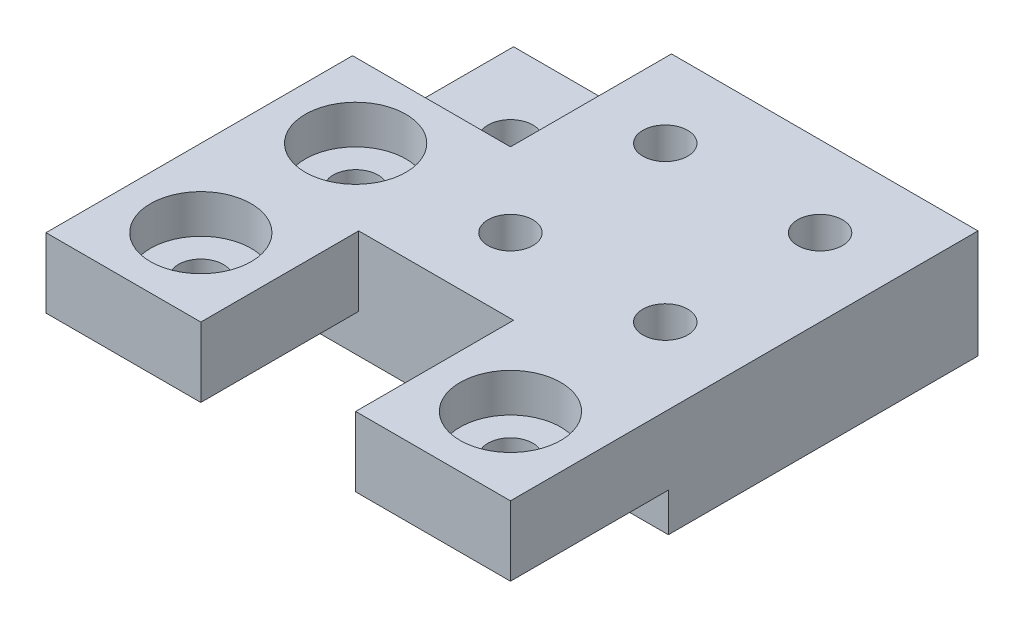
ISO-10303-21;
HEADER;
FILE_DESCRIPTION(('STEP AP214'),'2;1');
FILE_NAME('part.step','',(''),(''),'','','');
FILE_SCHEMA(('AUTOMOTIVE_DESIGN { 1 0 10303 214 1 1 1 1 }'));
ENDSEC;
DATA;
#1=APPLICATION_CONTEXT('core data for automotive mechanical design processes');
#2=APPLICATION_PROTOCOL_DEFINITION('international standard','automotive_design',2000,#1);
#3=PRODUCT_CONTEXT('',#1,'mechanical');
#4=PRODUCT('Part','Part','',(#3));
#5=PRODUCT_RELATED_PRODUCT_CATEGORY('part','',(#4));
#6=PRODUCT_DEFINITION_FORMATION('','',#4);
#7=PRODUCT_DEFINITION_CONTEXT('part definition',#1,'design');
#8=PRODUCT_DEFINITION('design','',#6,#7);
#9=PRODUCT_DEFINITION_SHAPE('','',#8);
#10=(LENGTH_UNIT() NAMED_UNIT(*) SI_UNIT(.MILLI.,.METRE.));
#11=(NAMED_UNIT(*) PLANE_ANGLE_UNIT() SI_UNIT($,.RADIAN.));
#12=(NAMED_UNIT(*) SI_UNIT($,.STERADIAN.) SOLID_ANGLE_UNIT());
#13=UNCERTAINTY_MEASURE_WITH_UNIT(LENGTH_MEASURE(1.E-05),#10,'distance_accuracy_value','');
#14=(GEOMETRIC_REPRESENTATION_CONTEXT(3) GLOBAL_UNCERTAINTY_ASSIGNED_CONTEXT((#13)) GLOBAL_UNIT_ASSIGNED_CONTEXT((#10,
#11,#12)) REPRESENTATION_CONTEXT('',''));
#15=CARTESIAN_POINT('',(0.,0.,0.));
#16=DIRECTION('',(0.,0.,1.));
#17=DIRECTION('',(1.,0.,0.));
#18=AXIS2_PLACEMENT_3D('',#15,#16,#17);
#19=CARTESIAN_POINT('',(-40.,2.5,50.));
#20=DIRECTION('',(1.,0.,0.));
#21=DIRECTION('',(0.,0.,-1.));
#22=AXIS2_PLACEMENT_3D('',#19,#20,#21);
#23=PLANE('',#22);
#24=DIRECTION('',(0.,0.,-1.));
#25=VECTOR('',#24,1.);
#26=CARTESIAN_POINT('',(-40.,2.5,50.));
#27=LINE('',#26,#25);
#28=CARTESIAN_POINT('',(-40.,2.5,60.));
#29=VERTEX_POINT('',#28);
#30=CARTESIAN_POINT('',(-40.,2.5,49.8000000000006));
#31=VERTEX_POINT('',#30);
#32=EDGE_CURVE('E255',#29,#31,#27,.T.);
#33=ORIENTED_EDGE('',*,*,#32,.T.);
#34=DIRECTION('',(0.,1.,0.));
#35=VECTOR('',#34,1.);
#36=CARTESIAN_POINT('',(-40.,0.,49.8000000000006));
#37=LINE('',#36,#35);
#38=CARTESIAN_POINT('',(-40.,7.,49.8000000000006));
#39=VERTEX_POINT('',#38);
#40=EDGE_CURVE('E175',#31,#39,#37,.T.);
#41=ORIENTED_EDGE('',*,*,#40,.T.);
#42=DIRECTION('',(0.,0.,-1.));
#43=VECTOR('',#42,1.);
#44=CARTESIAN_POINT('',(-40.,7.,50.));
#45=LINE('',#44,#43);
#46=CARTESIAN_POINT('',(-40.,7.,60.));
#47=VERTEX_POINT('',#46);
#48=EDGE_CURVE('E257',#47,#39,#45,.T.);
#49=ORIENTED_EDGE('',*,*,#48,.F.);
#50=DIRECTION('',(0.,1.,0.));
#51=VECTOR('',#50,1.);
#52=CARTESIAN_POINT('',(-40.,2.5,60.));
#53=LINE('',#52,#51);
#54=EDGE_CURVE('E245',#29,#47,#53,.T.);
#55=ORIENTED_EDGE('',*,*,#54,.F.);
#56=EDGE_LOOP('',(#33,#41,#49,#55));
#57=FACE_BOUND('',#56,.T.);
#58=ADVANCED_FACE('F39',(#57),#23,.T.);
#59=CARTESIAN_POINT('',(-30.,2.5,50.));
#60=DIRECTION('',(-1.,0.,0.));
#61=DIRECTION('',(0.,0.,1.));
#62=AXIS2_PLACEMENT_3D('',#59,#60,#61);
#63=PLANE('',#62);
#64=DIRECTION('',(0.,1.,0.));
#65=VECTOR('',#64,1.);
#66=CARTESIAN_POINT('',(-30.,0.,49.8000000000006));
#67=LINE('',#66,#65);
#68=CARTESIAN_POINT('',(-30.,2.5,49.8000000000006));
#69=VERTEX_POINT('',#68);
#70=CARTESIAN_POINT('',(-30.,7.,49.8000000000006));
#71=VERTEX_POINT('',#70);
#72=EDGE_CURVE('E176',#69,#71,#67,.T.);
#73=ORIENTED_EDGE('',*,*,#72,.F.);
#74=DIRECTION('',(0.,0.,1.));
#75=VECTOR('',#74,1.);
#76=CARTESIAN_POINT('',(-30.,2.5,50.));
#77=LINE('',#76,#75);
#78=CARTESIAN_POINT('',(-30.,2.5,60.));
#79=VERTEX_POINT('',#78);
#80=EDGE_CURVE('E145',#69,#79,#77,.T.);
#81=ORIENTED_EDGE('',*,*,#80,.T.);
#82=DIRECTION('',(0.,1.,0.));
#83=VECTOR('',#82,1.);
#84=CARTESIAN_POINT('',(-30.,2.5,60.));
#85=LINE('',#84,#83);
#86=CARTESIAN_POINT('',(-30.,7.,60.));
#87=VERTEX_POINT('',#86);
#88=EDGE_CURVE('E236',#79,#87,#85,.T.);
#89=ORIENTED_EDGE('',*,*,#88,.T.);
#90=DIRECTION('',(0.,0.,1.));
#91=VECTOR('',#90,1.);
#92=CARTESIAN_POINT('',(-30.,7.,50.));
#93=LINE('',#92,#91);
#94=EDGE_CURVE('E243',#71,#87,#93,.T.);
#95=ORIENTED_EDGE('',*,*,#94,.F.);
#96=EDGE_LOOP('',(#73,#81,#89,#95));
#97=FACE_BOUND('',#96,.T.);
#98=ADVANCED_FACE('F320',(#97),#63,.T.);
#99=CARTESIAN_POINT('',(-20.,2.5,50.));
#100=DIRECTION('',(1.,0.,0.));
#101=DIRECTION('',(0.,0.,-1.));
#102=AXIS2_PLACEMENT_3D('',#99,#100,#101);
#103=PLANE('',#102);
#104=DIRECTION('',(0.,0.,-1.));
#105=VECTOR('',#104,1.);
#106=CARTESIAN_POINT('',(-20.,2.5,50.));
#107=LINE('',#106,#105);
#108=CARTESIAN_POINT('',(-20.,2.5,60.));
#109=VERTEX_POINT('',#108);
#110=CARTESIAN_POINT('',(-20.,2.5,49.8000000000006));
#111=VERTEX_POINT('',#110);
#112=EDGE_CURVE('E238',#109,#111,#107,.T.);
#113=ORIENTED_EDGE('',*,*,#112,.T.);
#114=DIRECTION('',(0.,1.,0.));
#115=VECTOR('',#114,1.);
#116=CARTESIAN_POINT('',(-20.,0.,49.8000000000006));
#117=LINE('',#116,#115);
#118=CARTESIAN_POINT('',(-20.,0.,49.8000000000006));
#119=VERTEX_POINT('',#118);
#120=EDGE_CURVE('E11',#119,#111,#117,.T.);
#121=ORIENTED_EDGE('',*,*,#120,.F.);
#122=DIRECTION('',(0.,0.,-1.));
#123=VECTOR('',#122,1.);
#124=CARTESIAN_POINT('',(-20.,0.,0.));
#125=LINE('',#124,#123);
#126=CARTESIAN_POINT('',(-20.,0.,29.8));
#127=VERTEX_POINT('',#126);
#128=EDGE_CURVE('E152',#119,#127,#125,.T.);
#129=ORIENTED_EDGE('',*,*,#128,.T.);
#130=DIRECTION('',(0.,1.,0.));
#131=VECTOR('',#130,1.);
#132=CARTESIAN_POINT('',(-20.,-8.,29.8));
#133=LINE('',#132,#131);
#134=CARTESIAN_POINT('',(-20.,7.,29.8));
#135=VERTEX_POINT('',#134);
#136=EDGE_CURVE('E148',#127,#135,#133,.T.);
#137=ORIENTED_EDGE('',*,*,#136,.T.);
#138=DIRECTION('',(0.,0.,-1.));
#139=VECTOR('',#138,1.);
#140=CARTESIAN_POINT('',(-20.,7.,50.));
#141=LINE('',#140,#139);
#142=CARTESIAN_POINT('',(-20.,7.,60.));
#143=VERTEX_POINT('',#142);
#144=EDGE_CURVE('E134',#143,#135,#141,.T.);
#145=ORIENTED_EDGE('',*,*,#144,.F.);
#146=DIRECTION('',(0.,1.,0.));
#147=VECTOR('',#146,1.);
#148=CARTESIAN_POINT('',(-20.,2.5,60.));
#149=LINE('',#148,#147);
#150=EDGE_CURVE('E239',#109,#143,#149,.T.);
#151=ORIENTED_EDGE('',*,*,#150,.F.);
#152=EDGE_LOOP('',(#113,#121,#129,#137,#145,#151));
#153=FACE_BOUND('',#152,.T.);
#154=ADVANCED_FACE('F150',(#153),#103,.T.);
#155=CARTESIAN_POINT('',(-24.9999999999989,0.,55.));
#156=DIRECTION('',(0.,1.,0.));
#157=DIRECTION('',(0.,0.,1.));
#158=AXIS2_PLACEMENT_3D('',#155,#156,#157);
#159=CYLINDRICAL_SURFACE('',#158,1.45);
#160=CARTESIAN_POINT('',(-24.9999999999989,2.5,55.));
#161=DIRECTION('',(0.,1.,0.));
#162=DIRECTION('',(0.,0.,1.));
#163=AXIS2_PLACEMENT_3D('',#160,#161,#162);
#164=CIRCLE('',#163,1.45);
#165=CARTESIAN_POINT('',(-24.9999999999989,2.5,56.45));
#166=VERTEX_POINT('',#165);
#167=EDGE_CURVE('E227',#166,#166,#164,.T.);
#168=ORIENTED_EDGE('',*,*,#167,.F.);
#169=EDGE_LOOP('',(#168));
#170=FACE_BOUND('',#169,.T.);
#171=CARTESIAN_POINT('',(-24.9999999999989,4.5,55.));
#172=DIRECTION('',(0.,1.,0.));
#173=DIRECTION('',(0.,0.,1.));
#174=AXIS2_PLACEMENT_3D('',#171,#172,#173);
#175=CIRCLE('',#174,1.45);
#176=CARTESIAN_POINT('',(-24.9999999999989,4.5,56.45));
#177=VERTEX_POINT('',#176);
#178=EDGE_CURVE('E211',#177,#177,#175,.F.);
#179=ORIENTED_EDGE('',*,*,#178,.F.);
#180=EDGE_LOOP('',(#179));
#181=FACE_BOUND('',#180,.T.);
#182=ADVANCED_FACE('F307',(#170,#181),#159,.F.);
#183=CARTESIAN_POINT('',(-44.9999999999989,0.,55.));
#184=DIRECTION('',(0.,1.,0.));
#185=DIRECTION('',(0.,0.,1.));
#186=AXIS2_PLACEMENT_3D('',#183,#184,#185);
#187=CYLINDRICAL_SURFACE('',#186,1.45);
#188=CARTESIAN_POINT('',(-44.9999999999989,2.5,55.));
#189=DIRECTION('',(0.,1.,0.));
#190=DIRECTION('',(0.,0.,1.));
#191=AXIS2_PLACEMENT_3D('',#188,#189,#190);
#192=CIRCLE('',#191,1.45);
#193=CARTESIAN_POINT('',(-44.9999999999989,2.5,56.45));
#194=VERTEX_POINT('',#193);
#195=EDGE_CURVE('E293',#194,#194,#192,.T.);
#196=ORIENTED_EDGE('',*,*,#195,.F.);
#197=EDGE_LOOP('',(#196));
#198=FACE_BOUND('',#197,.T.);
#199=CARTESIAN_POINT('',(-44.9999999999989,4.5,55.));
#200=DIRECTION('',(0.,1.,0.));
#201=DIRECTION('',(0.,0.,1.));
#202=AXIS2_PLACEMENT_3D('',#199,#200,#201);
#203=CIRCLE('',#202,1.45);
#204=CARTESIAN_POINT('',(-44.9999999999989,4.5,56.45));
#205=VERTEX_POINT('',#204);
#206=EDGE_CURVE('E300',#205,#205,#203,.F.);
#207=ORIENTED_EDGE('',*,*,#206,.F.);
#208=EDGE_LOOP('',(#207));
#209=FACE_BOUND('',#208,.T.);
#210=ADVANCED_FACE('F309',(#198,#209),#187,.F.);
#211=CARTESIAN_POINT('',(-44.999999999999,0.,45.));
#212=DIRECTION('',(0.,1.,0.));
#213=DIRECTION('',(0.,0.,1.));
#214=AXIS2_PLACEMENT_3D('',#211,#212,#213);
#215=CYLINDRICAL_SURFACE('',#214,1.45);
#216=CARTESIAN_POINT('',(-44.999999999999,0.,45.));
#217=DIRECTION('',(0.,1.,0.));
#218=DIRECTION('',(0.,0.,1.));
#219=AXIS2_PLACEMENT_3D('',#216,#217,#218);
#220=CIRCLE('',#219,1.45);
#221=CARTESIAN_POINT('',(-44.999999999999,0.,46.45));
#222=VERTEX_POINT('',#221);
#223=EDGE_CURVE('E208',#222,#222,#220,.T.);
#224=ORIENTED_EDGE('',*,*,#223,.F.);
#225=EDGE_LOOP('',(#224));
#226=FACE_BOUND('',#225,.T.);
#227=CARTESIAN_POINT('',(-44.999999999999,4.5,45.));
#228=DIRECTION('',(0.,1.,0.));
#229=DIRECTION('',(0.,0.,1.));
#230=AXIS2_PLACEMENT_3D('',#227,#228,#229);
#231=CIRCLE('',#230,1.45);
#232=CARTESIAN_POINT('',(-44.999999999999,4.5,46.45));
#233=VERTEX_POINT('',#232);
#234=EDGE_CURVE('E201',#233,#233,#231,.F.);
#235=ORIENTED_EDGE('',*,*,#234,.F.);
#236=EDGE_LOOP('',(#235));
#237=FACE_BOUND('',#236,.T.);
#238=ADVANCED_FACE('F316',(#226,#237),#215,.F.);
#239=CARTESIAN_POINT('',(-50.,7.,50.));
#240=DIRECTION('',(1.,0.,0.));
#241=DIRECTION('',(0.,0.,-1.));
#242=AXIS2_PLACEMENT_3D('',#239,#240,#241);
#243=PLANE('',#242);
#244=DIRECTION('',(0.,0.,1.));
#245=VECTOR('',#244,1.);
#246=CARTESIAN_POINT('',(-50.,2.3,50.));
#247=LINE('',#246,#245);
#248=CARTESIAN_POINT('',(-50.,2.3,29.8));
#249=VERTEX_POINT('',#248);
#250=CARTESIAN_POINT('',(-50.,2.3,40.2));
#251=VERTEX_POINT('',#250);
#252=EDGE_CURVE('E47',#249,#251,#247,.T.);
#253=ORIENTED_EDGE('',*,*,#252,.F.);
#254=DIRECTION('',(0.,1.,0.));
#255=VECTOR('',#254,1.);
#256=CARTESIAN_POINT('',(-50.,-8.,29.8));
#257=LINE('',#256,#255);
#258=CARTESIAN_POINT('',(-50.,0.,29.8));
#259=VERTEX_POINT('',#258);
#260=EDGE_CURVE('E155',#259,#249,#257,.T.);
#261=ORIENTED_EDGE('',*,*,#260,.F.);
#262=DIRECTION('',(0.,0.,1.));
#263=VECTOR('',#262,1.);
#264=CARTESIAN_POINT('',(-50.,0.,50.));
#265=LINE('',#264,#263);
#266=CARTESIAN_POINT('',(-50.,0.,49.8000000000006));
#267=VERTEX_POINT('',#266);
#268=EDGE_CURVE('E284',#259,#267,#265,.T.);
#269=ORIENTED_EDGE('',*,*,#268,.T.);
#270=DIRECTION('',(0.,1.,0.));
#271=VECTOR('',#270,1.);
#272=CARTESIAN_POINT('',(-50.,7.,49.8000000000006));
#273=LINE('',#272,#271);
#274=CARTESIAN_POINT('',(-50.,2.5,49.8000000000006));
#275=VERTEX_POINT('',#274);
#276=EDGE_CURVE('E170',#267,#275,#273,.T.);
#277=ORIENTED_EDGE('',*,*,#276,.T.);
#278=DIRECTION('',(0.,0.,1.));
#279=VECTOR('',#278,1.);
#280=CARTESIAN_POINT('',(-50.,2.5,50.));
#281=LINE('',#280,#279);
#282=CARTESIAN_POINT('',(-50.,2.5,60.));
#283=VERTEX_POINT('',#282);
#284=EDGE_CURVE('E261',#275,#283,#281,.T.);
#285=ORIENTED_EDGE('',*,*,#284,.T.);
#286=DIRECTION('',(0.,1.,0.));
#287=VECTOR('',#286,1.);
#288=CARTESIAN_POINT('',(-50.,2.5,60.));
#289=LINE('',#288,#287);
#290=CARTESIAN_POINT('',(-50.,7.,60.));
#291=VERTEX_POINT('',#290);
#292=EDGE_CURVE('E252',#283,#291,#289,.T.);
#293=ORIENTED_EDGE('',*,*,#292,.T.);
#294=DIRECTION('',(0.,0.,1.));
#295=VECTOR('',#294,1.);
#296=CARTESIAN_POINT('',(-50.,7.,50.));
#297=LINE('',#296,#295);
#298=CARTESIAN_POINT('',(-50.,7.,40.2));
#299=VERTEX_POINT('',#298);
#300=EDGE_CURVE('E285',#299,#291,#297,.T.);
#301=ORIENTED_EDGE('',*,*,#300,.F.);
#302=DIRECTION('',(0.,-1.,0.));
#303=VECTOR('',#302,1.);
#304=CARTESIAN_POINT('',(-50.,7.,40.2));
#305=LINE('',#304,#303);
#306=EDGE_CURVE('E54',#299,#251,#305,.T.);
#307=ORIENTED_EDGE('',*,*,#306,.T.);
#308=EDGE_LOOP('',(#253,#261,#269,#277,#285,#293,#301,#307));
#309=FACE_BOUND('',#308,.T.);
#310=ADVANCED_FACE('F41',(#309),#243,.F.);
#311=CARTESIAN_POINT('',(0.,7.,0.));
#312=DIRECTION('',(0.,-1.,0.));
#313=DIRECTION('',(0.,0.,-1.));
#314=AXIS2_PLACEMENT_3D('',#311,#312,#313);
#315=PLANE('',#314);
#316=CARTESIAN_POINT('',(-24.9999999999989,7.,55.));
#317=DIRECTION('',(0.,1.,0.));
#318=DIRECTION('',(0.,0.,1.));
#319=AXIS2_PLACEMENT_3D('',#316,#317,#318);
#320=CIRCLE('',#319,3.25);
#321=CARTESIAN_POINT('',(-24.9999999999989,7.,58.25));
#322=VERTEX_POINT('',#321);
#323=EDGE_CURVE('E198',#322,#322,#320,.T.);
#324=ORIENTED_EDGE('',*,*,#323,.F.);
#325=EDGE_LOOP('',(#324));
#326=FACE_BOUND('',#325,.T.);
#327=CARTESIAN_POINT('',(-44.999999999999,7.,45.));
#328=DIRECTION('',(0.,1.,0.));
#329=DIRECTION('',(0.,0.,1.));
#330=AXIS2_PLACEMENT_3D('',#327,#328,#329);
#331=CIRCLE('',#330,3.25);
#332=CARTESIAN_POINT('',(-44.999999999999,7.,48.25));
#333=VERTEX_POINT('',#332);
#334=EDGE_CURVE('E186',#333,#333,#331,.T.);
#335=ORIENTED_EDGE('',*,*,#334,.F.);
#336=EDGE_LOOP('',(#335));
#337=FACE_BOUND('',#336,.T.);
#338=CARTESIAN_POINT('',(-44.9999999999989,7.,55.));
#339=DIRECTION('',(0.,1.,0.));
#340=DIRECTION('',(0.,0.,1.));
#341=AXIS2_PLACEMENT_3D('',#338,#339,#340);
#342=CIRCLE('',#341,3.25);
#343=CARTESIAN_POINT('',(-44.9999999999989,7.,58.25));
#344=VERTEX_POINT('',#343);
#345=EDGE_CURVE('E193',#344,#344,#342,.T.);
#346=ORIENTED_EDGE('',*,*,#345,.F.);
#347=EDGE_LOOP('',(#346));
#348=FACE_BOUND('',#347,.T.);
#349=CARTESIAN_POINT('',(-24.9999999999992,7.,35.));
#350=DIRECTION('',(0.,1.,0.));
#351=DIRECTION('',(0.,0.,1.));
#352=AXIS2_PLACEMENT_3D('',#349,#350,#351);
#353=CIRCLE('',#352,1.45);
#354=CARTESIAN_POINT('',(-24.9999999999992,7.,36.45));
#355=VERTEX_POINT('',#354);
#356=EDGE_CURVE('E224',#355,#355,#353,.T.);
#357=ORIENTED_EDGE('',*,*,#356,.F.);
#358=EDGE_LOOP('',(#357));
#359=FACE_BOUND('',#358,.T.);
#360=CARTESIAN_POINT('',(-34.9999999999991,7.,35.));
#361=DIRECTION('',(0.,1.,0.));
#362=DIRECTION('',(0.,0.,1.));
#363=AXIS2_PLACEMENT_3D('',#360,#361,#362);
#364=CIRCLE('',#363,1.45);
#365=CARTESIAN_POINT('',(-34.9999999999991,7.,36.45));
#366=VERTEX_POINT('',#365);
#367=EDGE_CURVE('E231',#366,#366,#364,.T.);
#368=ORIENTED_EDGE('',*,*,#367,.F.);
#369=EDGE_LOOP('',(#368));
#370=FACE_BOUND('',#369,.T.);
#371=CARTESIAN_POINT('',(-34.999999999999,7.,45.));
#372=DIRECTION('',(0.,1.,0.));
#373=DIRECTION('',(0.,0.,1.));
#374=AXIS2_PLACEMENT_3D('',#371,#372,#373);
#375=CIRCLE('',#374,1.45);
#376=CARTESIAN_POINT('',(-34.999999999999,7.,46.45));
#377=VERTEX_POINT('',#376);
#378=EDGE_CURVE('E219',#377,#377,#375,.T.);
#379=ORIENTED_EDGE('',*,*,#378,.F.);
#380=EDGE_LOOP('',(#379));
#381=FACE_BOUND('',#380,.T.);
#382=CARTESIAN_POINT('',(-24.999999999999,7.,45.));
#383=DIRECTION('',(0.,1.,0.));
#384=DIRECTION('',(0.,0.,1.));
#385=AXIS2_PLACEMENT_3D('',#382,#383,#384);
#386=CIRCLE('',#385,1.45);
#387=CARTESIAN_POINT('',(-24.999999999999,7.,46.45));
#388=VERTEX_POINT('',#387);
#389=EDGE_CURVE('E212',#388,#388,#386,.T.);
#390=ORIENTED_EDGE('',*,*,#389,.F.);
#391=EDGE_LOOP('',(#390));
#392=FACE_BOUND('',#391,.T.);
#393=ORIENTED_EDGE('',*,*,#144,.T.);
#394=DIRECTION('',(1.,0.,0.));
#395=VECTOR('',#394,1.);
#396=CARTESIAN_POINT('',(-50.,7.,29.8));
#397=LINE('',#396,#395);
#398=CARTESIAN_POINT('',(-39.7999999999992,7.,29.8));
#399=VERTEX_POINT('',#398);
#400=EDGE_CURVE('E139',#399,#135,#397,.T.);
#401=ORIENTED_EDGE('',*,*,#400,.F.);
#402=DIRECTION('',(0.,0.,-1.));
#403=VECTOR('',#402,1.);
#404=CARTESIAN_POINT('',(-39.7999999999992,7.,29.8));
#405=LINE('',#404,#403);
#406=CARTESIAN_POINT('',(-39.7999999999992,7.,40.2));
#407=VERTEX_POINT('',#406);
#408=EDGE_CURVE('E275',#407,#399,#405,.T.);
#409=ORIENTED_EDGE('',*,*,#408,.F.);
#410=DIRECTION('',(-1.,0.,0.));
#411=VECTOR('',#410,1.);
#412=CARTESIAN_POINT('',(0.,7.,40.2));
#413=LINE('',#412,#411);
#414=EDGE_CURVE('E287',#407,#299,#413,.T.);
#415=ORIENTED_EDGE('',*,*,#414,.T.);
#416=ORIENTED_EDGE('',*,*,#300,.T.);
#417=DIRECTION('',(1.,0.,0.));
#418=VECTOR('',#417,1.);
#419=CARTESIAN_POINT('',(-50.,7.,60.));
#420=LINE('',#419,#418);
#421=EDGE_CURVE('E260',#291,#47,#420,.T.);
#422=ORIENTED_EDGE('',*,*,#421,.T.);
#423=ORIENTED_EDGE('',*,*,#48,.T.);
#424=DIRECTION('',(-1.,0.,0.));
#425=VECTOR('',#424,1.);
#426=CARTESIAN_POINT('',(-30.,7.,49.8000000000006));
#427=LINE('',#426,#425);
#428=EDGE_CURVE('E180',#71,#39,#427,.T.);
#429=ORIENTED_EDGE('',*,*,#428,.F.);
#430=ORIENTED_EDGE('',*,*,#94,.T.);
#431=DIRECTION('',(1.,0.,0.));
#432=VECTOR('',#431,1.);
#433=CARTESIAN_POINT('',(-30.,7.,60.));
#434=LINE('',#433,#432);
#435=EDGE_CURVE('E143',#87,#143,#434,.T.);
#436=ORIENTED_EDGE('',*,*,#435,.T.);
#437=EDGE_LOOP('',(#393,#401,#409,#415,#416,#422,#423,#429,#430,#436));
#438=FACE_BOUND('',#437,.T.);
#439=ADVANCED_FACE('F136',(#326,#337,#348,#359,#370,#381,#392,#438),#315,.F.);
#440=CARTESIAN_POINT('',(0.,0.,0.));
#441=DIRECTION('',(0.,-1.,0.));
#442=DIRECTION('',(0.,0.,-1.));
#443=AXIS2_PLACEMENT_3D('',#440,#441,#442);
#444=PLANE('',#443);
#445=ORIENTED_EDGE('',*,*,#128,.F.);
#446=DIRECTION('',(-1.,0.,0.));
#447=VECTOR('',#446,1.);
#448=CARTESIAN_POINT('',(-30.,0.,49.8000000000006));
#449=LINE('',#448,#447);
#450=EDGE_CURVE('E178',#119,#267,#449,.T.);
#451=ORIENTED_EDGE('',*,*,#450,.T.);
#452=ORIENTED_EDGE('',*,*,#268,.F.);
#453=DIRECTION('',(-1.,0.,0.));
#454=VECTOR('',#453,1.);
#455=CARTESIAN_POINT('',(0.,0.,29.8));
#456=LINE('',#455,#454);
#457=EDGE_CURVE('E164',#127,#259,#456,.T.);
#458=ORIENTED_EDGE('',*,*,#457,.F.);
#459=EDGE_LOOP('',(#445,#451,#452,#458));
#460=FACE_BOUND('',#459,.T.);
#461=CARTESIAN_POINT('',(-44.9999999999992,0.,35.));
#462=DIRECTION('',(0.,1.,0.));
#463=DIRECTION('',(0.,0.,1.));
#464=AXIS2_PLACEMENT_3D('',#461,#462,#463);
#465=CIRCLE('',#464,1.45);
#466=CARTESIAN_POINT('',(-44.9999999999992,0.,36.45));
#467=VERTEX_POINT('',#466);
#468=EDGE_CURVE('E204',#467,#467,#465,.T.);
#469=ORIENTED_EDGE('',*,*,#468,.T.);
#470=EDGE_LOOP('',(#469));
#471=FACE_BOUND('',#470,.T.);
#472=ORIENTED_EDGE('',*,*,#223,.T.);
#473=EDGE_LOOP('',(#472));
#474=FACE_BOUND('',#473,.T.);
#475=CARTESIAN_POINT('',(-24.9999999999992,0.,35.));
#476=DIRECTION('',(0.,1.,0.));
#477=DIRECTION('',(0.,0.,1.));
#478=AXIS2_PLACEMENT_3D('',#475,#476,#477);
#479=CIRCLE('',#478,1.45);
#480=CARTESIAN_POINT('',(-24.9999999999992,0.,36.45));
#481=VERTEX_POINT('',#480);
#482=EDGE_CURVE('E228',#481,#481,#479,.T.);
#483=ORIENTED_EDGE('',*,*,#482,.T.);
#484=EDGE_LOOP('',(#483));
#485=FACE_BOUND('',#484,.T.);
#486=CARTESIAN_POINT('',(-34.9999999999991,0.,35.));
#487=DIRECTION('',(0.,1.,0.));
#488=DIRECTION('',(0.,0.,1.));
#489=AXIS2_PLACEMENT_3D('',#486,#487,#488);
#490=CIRCLE('',#489,1.45);
#491=CARTESIAN_POINT('',(-34.9999999999991,0.,36.45));
#492=VERTEX_POINT('',#491);
#493=EDGE_CURVE('E215',#492,#492,#490,.T.);
#494=ORIENTED_EDGE('',*,*,#493,.T.);
#495=EDGE_LOOP('',(#494));
#496=FACE_BOUND('',#495,.T.);
#497=CARTESIAN_POINT('',(-34.999999999999,0.,45.));
#498=DIRECTION('',(0.,1.,0.));
#499=DIRECTION('',(0.,0.,1.));
#500=AXIS2_PLACEMENT_3D('',#497,#498,#499);
#501=CIRCLE('',#500,1.45);
#502=CARTESIAN_POINT('',(-34.999999999999,0.,46.45));
#503=VERTEX_POINT('',#502);
#504=EDGE_CURVE('E207',#503,#503,#501,.T.);
#505=ORIENTED_EDGE('',*,*,#504,.T.);
#506=EDGE_LOOP('',(#505));
#507=FACE_BOUND('',#506,.T.);
#508=CARTESIAN_POINT('',(-24.999999999999,0.,45.));
#509=DIRECTION('',(0.,1.,0.));
#510=DIRECTION('',(0.,0.,1.));
#511=AXIS2_PLACEMENT_3D('',#508,#509,#510);
#512=CIRCLE('',#511,1.45);
#513=CARTESIAN_POINT('',(-24.999999999999,0.,46.45));
#514=VERTEX_POINT('',#513);
#515=EDGE_CURVE('E216',#514,#514,#512,.T.);
#516=ORIENTED_EDGE('',*,*,#515,.T.);
#517=EDGE_LOOP('',(#516));
#518=FACE_BOUND('',#517,.T.);
#519=ADVANCED_FACE('F353',(#460,#471,#474,#485,#496,#507,#518),#444,.T.);
#520=CARTESIAN_POINT('',(0.,2.3,0.));
#521=DIRECTION('',(0.,1.,0.));
#522=DIRECTION('',(0.,0.,1.));
#523=AXIS2_PLACEMENT_3D('',#520,#521,#522);
#524=PLANE('',#523);
#525=CARTESIAN_POINT('',(-44.9999999999992,2.3,35.));
#526=DIRECTION('',(0.,1.,0.));
#527=DIRECTION('',(0.,0.,1.));
#528=AXIS2_PLACEMENT_3D('',#525,#526,#527);
#529=CIRCLE('',#528,1.45);
#530=CARTESIAN_POINT('',(-44.9999999999992,2.3,36.45));
#531=VERTEX_POINT('',#530);
#532=EDGE_CURVE('E240',#531,#531,#529,.T.);
#533=ORIENTED_EDGE('',*,*,#532,.F.);
#534=EDGE_LOOP('',(#533));
#535=FACE_BOUND('',#534,.T.);
#536=ORIENTED_EDGE('',*,*,#252,.T.);
#537=DIRECTION('',(1.,0.,0.));
#538=VECTOR('',#537,1.);
#539=CARTESIAN_POINT('',(-50.1999999999992,2.3,40.2));
#540=LINE('',#539,#538);
#541=CARTESIAN_POINT('',(-39.7999999999992,2.3,40.2));
#542=VERTEX_POINT('',#541);
#543=EDGE_CURVE('E277',#251,#542,#540,.T.);
#544=ORIENTED_EDGE('',*,*,#543,.T.);
#545=DIRECTION('',(0.,0.,-1.));
#546=VECTOR('',#545,1.);
#547=CARTESIAN_POINT('',(-39.7999999999992,2.3,29.8));
#548=LINE('',#547,#546);
#549=CARTESIAN_POINT('',(-39.7999999999992,2.3,29.8));
#550=VERTEX_POINT('',#549);
#551=EDGE_CURVE('E279',#542,#550,#548,.T.);
#552=ORIENTED_EDGE('',*,*,#551,.T.);
#553=DIRECTION('',(-1.,0.,0.));
#554=VECTOR('',#553,1.);
#555=CARTESIAN_POINT('',(-50.1999999999992,2.3,29.8));
#556=LINE('',#555,#554);
#557=EDGE_CURVE('E273',#550,#249,#556,.T.);
#558=ORIENTED_EDGE('',*,*,#557,.T.);
#559=EDGE_LOOP('',(#536,#544,#552,#558));
#560=FACE_BOUND('',#559,.T.);
#561=ADVANCED_FACE('F347',(#535,#560),#524,.T.);
#562=CARTESIAN_POINT('',(-50.1999999999992,2.3,40.2));
#563=DIRECTION('',(0.,0.,1.));
#564=DIRECTION('',(1.,0.,0.));
#565=AXIS2_PLACEMENT_3D('',#562,#563,#564);
#566=PLANE('',#565);
#567=ORIENTED_EDGE('',*,*,#414,.F.);
#568=DIRECTION('',(0.,1.,0.));
#569=VECTOR('',#568,1.);
#570=CARTESIAN_POINT('',(-39.7999999999992,2.3,40.2));
#571=LINE('',#570,#569);
#572=EDGE_CURVE('E270',#542,#407,#571,.T.);
#573=ORIENTED_EDGE('',*,*,#572,.F.);
#574=ORIENTED_EDGE('',*,*,#543,.F.);
#575=ORIENTED_EDGE('',*,*,#306,.F.);
#576=EDGE_LOOP('',(#567,#573,#574,#575));
#577=FACE_BOUND('',#576,.T.);
#578=ADVANCED_FACE('F343',(#577),#566,.F.);
#579=CARTESIAN_POINT('',(-39.7999999999992,2.3,29.8));
#580=DIRECTION('',(1.,0.,0.));
#581=DIRECTION('',(0.,0.,-1.));
#582=AXIS2_PLACEMENT_3D('',#579,#580,#581);
#583=PLANE('',#582);
#584=ORIENTED_EDGE('',*,*,#408,.T.);
#585=DIRECTION('',(0.,1.,0.));
#586=VECTOR('',#585,1.);
#587=CARTESIAN_POINT('',(-39.7999999999992,2.3,29.8));
#588=LINE('',#587,#586);
#589=EDGE_CURVE('E159',#550,#399,#588,.T.);
#590=ORIENTED_EDGE('',*,*,#589,.F.);
#591=ORIENTED_EDGE('',*,*,#551,.F.);
#592=ORIENTED_EDGE('',*,*,#572,.T.);
#593=EDGE_LOOP('',(#584,#590,#591,#592));
#594=FACE_BOUND('',#593,.T.);
#595=ADVANCED_FACE('F346',(#594),#583,.F.);
#596=CARTESIAN_POINT('',(-50.,2.5,60.));
#597=DIRECTION('',(0.,0.,1.));
#598=DIRECTION('',(1.,0.,0.));
#599=AXIS2_PLACEMENT_3D('',#596,#597,#598);
#600=PLANE('',#599);
#601=ORIENTED_EDGE('',*,*,#421,.F.);
#602=ORIENTED_EDGE('',*,*,#292,.F.);
#603=DIRECTION('',(1.,0.,0.));
#604=VECTOR('',#603,1.);
#605=CARTESIAN_POINT('',(-50.,2.5,60.));
#606=LINE('',#605,#604);
#607=EDGE_CURVE('E265',#283,#29,#606,.T.);
#608=ORIENTED_EDGE('',*,*,#607,.T.);
#609=ORIENTED_EDGE('',*,*,#54,.T.);
#610=EDGE_LOOP('',(#601,#602,#608,#609));
#611=FACE_BOUND('',#610,.T.);
#612=ADVANCED_FACE('F336',(#611),#600,.T.);
#613=CARTESIAN_POINT('',(0.,2.5,0.));
#614=DIRECTION('',(0.,1.,0.));
#615=DIRECTION('',(0.,0.,1.));
#616=AXIS2_PLACEMENT_3D('',#613,#614,#615);
#617=PLANE('',#616);
#618=ORIENTED_EDGE('',*,*,#195,.T.);
#619=EDGE_LOOP('',(#618));
#620=FACE_BOUND('',#619,.T.);
#621=ORIENTED_EDGE('',*,*,#284,.F.);
#622=DIRECTION('',(1.,0.,0.));
#623=VECTOR('',#622,1.);
#624=CARTESIAN_POINT('',(-40.,2.5,49.8000000000006));
#625=LINE('',#624,#623);
#626=EDGE_CURVE('E167',#275,#31,#625,.T.);
#627=ORIENTED_EDGE('',*,*,#626,.T.);
#628=ORIENTED_EDGE('',*,*,#32,.F.);
#629=ORIENTED_EDGE('',*,*,#607,.F.);
#630=EDGE_LOOP('',(#621,#627,#628,#629));
#631=FACE_BOUND('',#630,.T.);
#632=ADVANCED_FACE('F338',(#620,#631),#617,.F.);
#633=CARTESIAN_POINT('',(-30.,2.5,60.));
#634=DIRECTION('',(0.,0.,1.));
#635=DIRECTION('',(1.,0.,0.));
#636=AXIS2_PLACEMENT_3D('',#633,#634,#635);
#637=PLANE('',#636);
#638=ORIENTED_EDGE('',*,*,#435,.F.);
#639=ORIENTED_EDGE('',*,*,#88,.F.);
#640=DIRECTION('',(1.,0.,0.));
#641=VECTOR('',#640,1.);
#642=CARTESIAN_POINT('',(-30.,2.5,60.));
#643=LINE('',#642,#641);
#644=EDGE_CURVE('E247',#79,#109,#643,.T.);
#645=ORIENTED_EDGE('',*,*,#644,.T.);
#646=ORIENTED_EDGE('',*,*,#150,.T.);
#647=EDGE_LOOP('',(#638,#639,#645,#646));
#648=FACE_BOUND('',#647,.T.);
#649=ADVANCED_FACE('F341',(#648),#637,.T.);
#650=CARTESIAN_POINT('',(0.,2.5,0.));
#651=DIRECTION('',(0.,1.,0.));
#652=DIRECTION('',(0.,0.,1.));
#653=AXIS2_PLACEMENT_3D('',#650,#651,#652);
#654=PLANE('',#653);
#655=ORIENTED_EDGE('',*,*,#167,.T.);
#656=EDGE_LOOP('',(#655));
#657=FACE_BOUND('',#656,.T.);
#658=ORIENTED_EDGE('',*,*,#80,.F.);
#659=DIRECTION('',(1.,0.,0.));
#660=VECTOR('',#659,1.);
#661=CARTESIAN_POINT('',(-20.,2.5,49.8000000000006));
#662=LINE('',#661,#660);
#663=EDGE_CURVE('E166',#69,#111,#662,.T.);
#664=ORIENTED_EDGE('',*,*,#663,.T.);
#665=ORIENTED_EDGE('',*,*,#112,.F.);
#666=ORIENTED_EDGE('',*,*,#644,.F.);
#667=EDGE_LOOP('',(#658,#664,#665,#666));
#668=FACE_BOUND('',#667,.T.);
#669=ADVANCED_FACE('F389',(#657,#668),#654,.F.);
#670=CARTESIAN_POINT('',(-44.9999999999992,0.,35.));
#671=DIRECTION('',(0.,1.,0.));
#672=DIRECTION('',(0.,0.,1.));
#673=AXIS2_PLACEMENT_3D('',#670,#671,#672);
#674=CYLINDRICAL_SURFACE('',#673,1.45);
#675=ORIENTED_EDGE('',*,*,#532,.T.);
#676=EDGE_LOOP('',(#675));
#677=FACE_BOUND('',#676,.T.);
#678=ORIENTED_EDGE('',*,*,#468,.F.);
#679=EDGE_LOOP('',(#678));
#680=FACE_BOUND('',#679,.T.);
#681=ADVANCED_FACE('F379',(#677,#680),#674,.F.);
#682=CARTESIAN_POINT('',(-24.999999999999,0.,45.));
#683=DIRECTION('',(0.,1.,0.));
#684=DIRECTION('',(0.,0.,1.));
#685=AXIS2_PLACEMENT_3D('',#682,#683,#684);
#686=CYLINDRICAL_SURFACE('',#685,1.45);
#687=ORIENTED_EDGE('',*,*,#515,.F.);
#688=EDGE_LOOP('',(#687));
#689=FACE_BOUND('',#688,.T.);
#690=ORIENTED_EDGE('',*,*,#389,.T.);
#691=EDGE_LOOP('',(#690));
#692=FACE_BOUND('',#691,.T.);
#693=ADVANCED_FACE('F375',(#689,#692),#686,.F.);
#694=CARTESIAN_POINT('',(-34.999999999999,0.,45.));
#695=DIRECTION('',(0.,1.,0.));
#696=DIRECTION('',(0.,0.,1.));
#697=AXIS2_PLACEMENT_3D('',#694,#695,#696);
#698=CYLINDRICAL_SURFACE('',#697,1.45);
#699=ORIENTED_EDGE('',*,*,#504,.F.);
#700=EDGE_LOOP('',(#699));
#701=FACE_BOUND('',#700,.T.);
#702=ORIENTED_EDGE('',*,*,#378,.T.);
#703=EDGE_LOOP('',(#702));
#704=FACE_BOUND('',#703,.T.);
#705=ADVANCED_FACE('F378',(#701,#704),#698,.F.);
#706=CARTESIAN_POINT('',(-34.9999999999991,0.,35.));
#707=DIRECTION('',(0.,1.,0.));
#708=DIRECTION('',(0.,0.,1.));
#709=AXIS2_PLACEMENT_3D('',#706,#707,#708);
#710=CYLINDRICAL_SURFACE('',#709,1.45);
#711=ORIENTED_EDGE('',*,*,#493,.F.);
#712=EDGE_LOOP('',(#711));
#713=FACE_BOUND('',#712,.T.);
#714=ORIENTED_EDGE('',*,*,#367,.T.);
#715=EDGE_LOOP('',(#714));
#716=FACE_BOUND('',#715,.T.);
#717=ADVANCED_FACE('F386',(#713,#716),#710,.F.);
#718=CARTESIAN_POINT('',(-24.9999999999992,0.,35.));
#719=DIRECTION('',(0.,1.,0.));
#720=DIRECTION('',(0.,0.,1.));
#721=AXIS2_PLACEMENT_3D('',#718,#719,#720);
#722=CYLINDRICAL_SURFACE('',#721,1.45);
#723=ORIENTED_EDGE('',*,*,#482,.F.);
#724=EDGE_LOOP('',(#723));
#725=FACE_BOUND('',#724,.T.);
#726=ORIENTED_EDGE('',*,*,#356,.T.);
#727=EDGE_LOOP('',(#726));
#728=FACE_BOUND('',#727,.T.);
#729=ADVANCED_FACE('F393',(#725,#728),#722,.F.);
#730=CARTESIAN_POINT('',(-44.999999999999,4.5,45.));
#731=DIRECTION('',(0.,1.,0.));
#732=DIRECTION('',(0.,0.,1.));
#733=AXIS2_PLACEMENT_3D('',#730,#731,#732);
#734=PLANE('',#733);
#735=CARTESIAN_POINT('',(-44.999999999999,4.5,45.));
#736=DIRECTION('',(0.,1.,0.));
#737=DIRECTION('',(0.,0.,1.));
#738=AXIS2_PLACEMENT_3D('',#735,#736,#737);
#739=CIRCLE('',#738,3.25);
#740=CARTESIAN_POINT('',(-44.999999999999,4.5,48.25));
#741=VERTEX_POINT('',#740);
#742=EDGE_CURVE('E190',#741,#741,#739,.T.);
#743=ORIENTED_EDGE('',*,*,#742,.T.);
#744=EDGE_LOOP('',(#743));
#745=FACE_BOUND('',#744,.T.);
#746=ORIENTED_EDGE('',*,*,#234,.T.);
#747=EDGE_LOOP('',(#746));
#748=FACE_BOUND('',#747,.T.);
#749=ADVANCED_FACE('F395',(#745,#748),#734,.T.);
#750=CARTESIAN_POINT('',(-44.999999999999,4.5,45.));
#751=DIRECTION('',(0.,1.,0.));
#752=DIRECTION('',(0.,0.,1.));
#753=AXIS2_PLACEMENT_3D('',#750,#751,#752);
#754=CYLINDRICAL_SURFACE('',#753,3.25);
#755=ORIENTED_EDGE('',*,*,#742,.F.);
#756=EDGE_LOOP('',(#755));
#757=FACE_BOUND('',#756,.T.);
#758=ORIENTED_EDGE('',*,*,#334,.T.);
#759=EDGE_LOOP('',(#758));
#760=FACE_BOUND('',#759,.T.);
#761=ADVANCED_FACE('F500',(#757,#760),#754,.F.);
#762=CARTESIAN_POINT('',(-44.9999999999989,4.5,55.));
#763=DIRECTION('',(0.,1.,0.));
#764=DIRECTION('',(0.,0.,1.));
#765=AXIS2_PLACEMENT_3D('',#762,#763,#764);
#766=PLANE('',#765);
#767=CARTESIAN_POINT('',(-44.9999999999989,4.5,55.));
#768=DIRECTION('',(0.,1.,0.));
#769=DIRECTION('',(0.,0.,1.));
#770=AXIS2_PLACEMENT_3D('',#767,#768,#769);
#771=CIRCLE('',#770,3.25);
#772=CARTESIAN_POINT('',(-44.9999999999989,4.5,58.25));
#773=VERTEX_POINT('',#772);
#774=EDGE_CURVE('E183',#773,#773,#771,.T.);
#775=ORIENTED_EDGE('',*,*,#774,.T.);
#776=EDGE_LOOP('',(#775));
#777=FACE_BOUND('',#776,.T.);
#778=ORIENTED_EDGE('',*,*,#206,.T.);
#779=EDGE_LOOP('',(#778));
#780=FACE_BOUND('',#779,.T.);
#781=ADVANCED_FACE('F510',(#777,#780),#766,.T.);
#782=CARTESIAN_POINT('',(-44.9999999999989,4.5,55.));
#783=DIRECTION('',(0.,1.,0.));
#784=DIRECTION('',(0.,0.,1.));
#785=AXIS2_PLACEMENT_3D('',#782,#783,#784);
#786=CYLINDRICAL_SURFACE('',#785,3.25);
#787=ORIENTED_EDGE('',*,*,#774,.F.);
#788=EDGE_LOOP('',(#787));
#789=FACE_BOUND('',#788,.T.);
#790=ORIENTED_EDGE('',*,*,#345,.T.);
#791=EDGE_LOOP('',(#790));
#792=FACE_BOUND('',#791,.T.);
#793=ADVANCED_FACE('F520',(#789,#792),#786,.F.);
#794=CARTESIAN_POINT('',(-24.9999999999989,4.5,55.));
#795=DIRECTION('',(0.,1.,0.));
#796=DIRECTION('',(0.,0.,1.));
#797=AXIS2_PLACEMENT_3D('',#794,#795,#796);
#798=PLANE('',#797);
#799=CARTESIAN_POINT('',(-24.9999999999989,4.5,55.));
#800=DIRECTION('',(0.,1.,0.));
#801=DIRECTION('',(0.,0.,1.));
#802=AXIS2_PLACEMENT_3D('',#799,#800,#801);
#803=CIRCLE('',#802,3.25);
#804=CARTESIAN_POINT('',(-24.9999999999989,4.5,58.25));
#805=VERTEX_POINT('',#804);
#806=EDGE_CURVE('E189',#805,#805,#803,.T.);
#807=ORIENTED_EDGE('',*,*,#806,.T.);
#808=EDGE_LOOP('',(#807));
#809=FACE_BOUND('',#808,.T.);
#810=ORIENTED_EDGE('',*,*,#178,.T.);
#811=EDGE_LOOP('',(#810));
#812=FACE_BOUND('',#811,.T.);
#813=ADVANCED_FACE('F305',(#809,#812),#798,.T.);
#814=CARTESIAN_POINT('',(-24.9999999999989,4.5,55.));
#815=DIRECTION('',(0.,1.,0.));
#816=DIRECTION('',(0.,0.,1.));
#817=AXIS2_PLACEMENT_3D('',#814,#815,#816);
#818=CYLINDRICAL_SURFACE('',#817,3.25);
#819=ORIENTED_EDGE('',*,*,#806,.F.);
#820=EDGE_LOOP('',(#819));
#821=FACE_BOUND('',#820,.T.);
#822=ORIENTED_EDGE('',*,*,#323,.T.);
#823=EDGE_LOOP('',(#822));
#824=FACE_BOUND('',#823,.T.);
#825=ADVANCED_FACE('F539',(#821,#824),#818,.F.);
#826=CARTESIAN_POINT('',(-30.,0.,49.8000000000006));
#827=DIRECTION('',(0.,0.,-1.));
#828=DIRECTION('',(-1.,0.,0.));
#829=AXIS2_PLACEMENT_3D('',#826,#827,#828);
#830=PLANE('',#829);
#831=ORIENTED_EDGE('',*,*,#450,.F.);
#832=ORIENTED_EDGE('',*,*,#120,.T.);
#833=ORIENTED_EDGE('',*,*,#663,.F.);
#834=ORIENTED_EDGE('',*,*,#72,.T.);
#835=ORIENTED_EDGE('',*,*,#428,.T.);
#836=ORIENTED_EDGE('',*,*,#40,.F.);
#837=ORIENTED_EDGE('',*,*,#626,.F.);
#838=ORIENTED_EDGE('',*,*,#276,.F.);
#839=EDGE_LOOP('',(#831,#832,#833,#834,#835,#836,#837,#838));
#840=FACE_BOUND('',#839,.T.);
#841=ADVANCED_FACE('F413',(#840),#830,.F.);
#842=CARTESIAN_POINT('',(-50.,-8.,29.8));
#843=DIRECTION('',(0.,0.,1.));
#844=DIRECTION('',(1.,0.,0.));
#845=AXIS2_PLACEMENT_3D('',#842,#843,#844);
#846=PLANE('',#845);
#847=ORIENTED_EDGE('',*,*,#457,.T.);
#848=ORIENTED_EDGE('',*,*,#260,.T.);
#849=ORIENTED_EDGE('',*,*,#557,.F.);
#850=ORIENTED_EDGE('',*,*,#589,.T.);
#851=ORIENTED_EDGE('',*,*,#400,.T.);
#852=ORIENTED_EDGE('',*,*,#136,.F.);
#853=EDGE_LOOP('',(#847,#848,#849,#850,#851,#852));
#854=FACE_BOUND('',#853,.T.);
#855=ADVANCED_FACE('F157',(#854),#846,.F.);
#856=CLOSED_SHELL('',(#58,#98,#154,#182,#210,#238,#310,#439,#519,#561,#578,#595,#612,#632,#649,
#669,#681,#693,#705,#717,#729,#749,#761,#781,#793,#813,#825,#841,#855));
#857=MANIFOLD_SOLID_BREP('B2',#856);
#858=ADVANCED_BREP_SHAPE_REPRESENTATION('',(#18,#857),#14);
#859=SHAPE_DEFINITION_REPRESENTATION(#9,#858);
ENDSEC;
END-ISO-10303-21;
